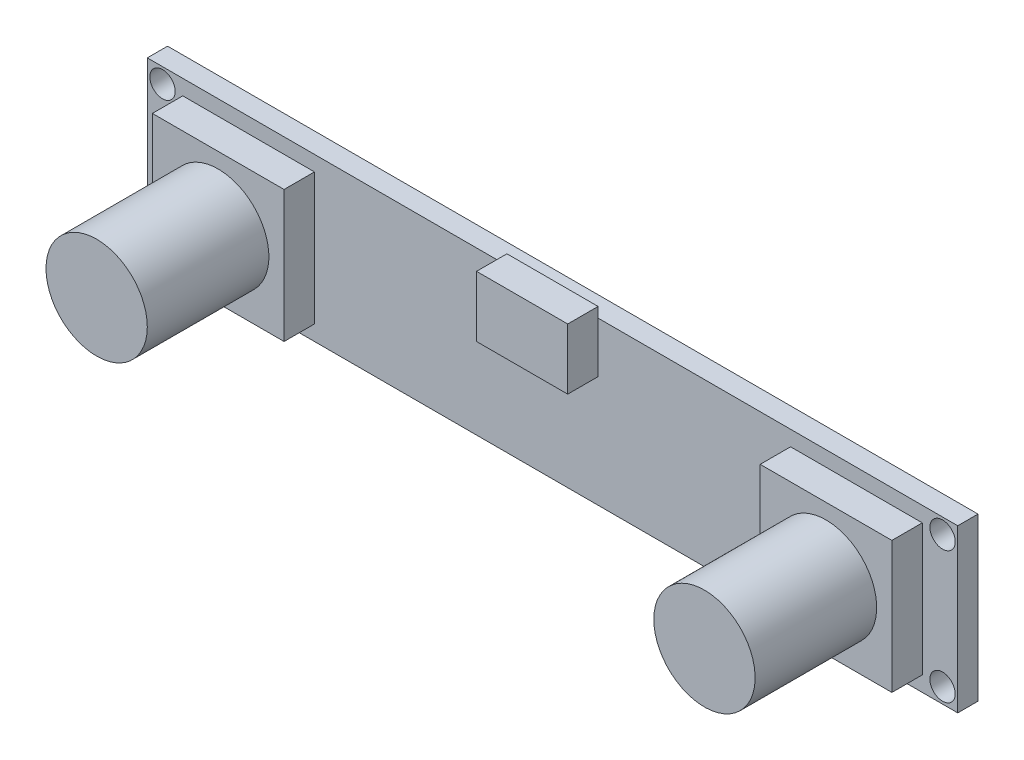
ISO-10303-21;
HEADER;
FILE_DESCRIPTION(('STEP AP214'),'2;1');
FILE_NAME('part.step','',(''),(''),'','','');
FILE_SCHEMA(('AUTOMOTIVE_DESIGN { 1 0 10303 214 1 1 1 1 }'));
ENDSEC;
DATA;
#1=APPLICATION_CONTEXT('core data for automotive mechanical design processes');
#2=APPLICATION_PROTOCOL_DEFINITION('international standard','automotive_design',2000,#1);
#3=PRODUCT_CONTEXT('',#1,'mechanical');
#4=PRODUCT('Part','Part','',(#3));
#5=PRODUCT_RELATED_PRODUCT_CATEGORY('part','',(#4));
#6=PRODUCT_DEFINITION_FORMATION('','',#4);
#7=PRODUCT_DEFINITION_CONTEXT('part definition',#1,'design');
#8=PRODUCT_DEFINITION('design','',#6,#7);
#9=PRODUCT_DEFINITION_SHAPE('','',#8);
#10=(LENGTH_UNIT() NAMED_UNIT(*) SI_UNIT(.MILLI.,.METRE.));
#11=(NAMED_UNIT(*) PLANE_ANGLE_UNIT() SI_UNIT($,.RADIAN.));
#12=(NAMED_UNIT(*) SI_UNIT($,.STERADIAN.) SOLID_ANGLE_UNIT());
#13=UNCERTAINTY_MEASURE_WITH_UNIT(LENGTH_MEASURE(1.E-05),#10,'distance_accuracy_value','');
#14=(GEOMETRIC_REPRESENTATION_CONTEXT(3) GLOBAL_UNCERTAINTY_ASSIGNED_CONTEXT((#13)) GLOBAL_UNIT_ASSIGNED_CONTEXT((#10,
#11,#12)) REPRESENTATION_CONTEXT('',''));
#15=CARTESIAN_POINT('',(0.,0.,0.));
#16=DIRECTION('',(0.,0.,1.));
#17=DIRECTION('',(1.,0.,0.));
#18=AXIS2_PLACEMENT_3D('',#15,#16,#17);
#19=CARTESIAN_POINT('',(0.,0.,2.));
#20=DIRECTION('',(0.,0.,-1.));
#21=DIRECTION('',(-1.,0.,0.));
#22=AXIS2_PLACEMENT_3D('',#19,#20,#21);
#23=PLANE('',#22);
#24=DIRECTION('',(0.,1.,0.));
#25=VECTOR('',#24,1.);
#26=CARTESIAN_POINT('',(-23.5,-6.5,2.));
#27=LINE('',#26,#25);
#28=CARTESIAN_POINT('',(-23.5,-6.5,2.));
#29=VERTEX_POINT('',#28);
#30=CARTESIAN_POINT('',(-23.5,6.5,2.));
#31=VERTEX_POINT('',#30);
#32=EDGE_CURVE('E226',#29,#31,#27,.T.);
#33=ORIENTED_EDGE('',*,*,#32,.F.);
#34=DIRECTION('',(1.,0.,0.));
#35=VECTOR('',#34,1.);
#36=CARTESIAN_POINT('',(-36.5,-6.5,2.));
#37=LINE('',#36,#35);
#38=CARTESIAN_POINT('',(-36.5,-6.5,2.));
#39=VERTEX_POINT('',#38);
#40=EDGE_CURVE('E231',#39,#29,#37,.T.);
#41=ORIENTED_EDGE('',*,*,#40,.F.);
#42=DIRECTION('',(0.,-1.,0.));
#43=VECTOR('',#42,1.);
#44=CARTESIAN_POINT('',(-36.5,-6.5,2.));
#45=LINE('',#44,#43);
#46=CARTESIAN_POINT('',(-36.5,6.5,2.));
#47=VERTEX_POINT('',#46);
#48=EDGE_CURVE('E243',#47,#39,#45,.T.);
#49=ORIENTED_EDGE('',*,*,#48,.F.);
#50=DIRECTION('',(-1.,0.,0.));
#51=VECTOR('',#50,1.);
#52=CARTESIAN_POINT('',(-36.5,6.5,2.));
#53=LINE('',#52,#51);
#54=EDGE_CURVE('E240',#31,#47,#53,.T.);
#55=ORIENTED_EDGE('',*,*,#54,.F.);
#56=EDGE_LOOP('',(#33,#41,#49,#55));
#57=FACE_BOUND('',#56,.T.);
#58=CARTESIAN_POINT('',(38.5,6.5,2.));
#59=DIRECTION('',(0.,0.,1.));
#60=DIRECTION('',(1.,0.,0.));
#61=AXIS2_PLACEMENT_3D('',#58,#59,#60);
#62=CIRCLE('',#61,1.25);
#63=CARTESIAN_POINT('',(39.75,6.5,2.));
#64=VERTEX_POINT('',#63);
#65=EDGE_CURVE('E264',#64,#64,#62,.T.);
#66=ORIENTED_EDGE('',*,*,#65,.F.);
#67=EDGE_LOOP('',(#66));
#68=FACE_BOUND('',#67,.T.);
#69=CARTESIAN_POINT('',(38.5,-6.5,2.));
#70=DIRECTION('',(0.,0.,1.));
#71=DIRECTION('',(1.,0.,0.));
#72=AXIS2_PLACEMENT_3D('',#69,#70,#71);
#73=CIRCLE('',#72,1.25);
#74=CARTESIAN_POINT('',(39.75,-6.5,2.));
#75=VERTEX_POINT('',#74);
#76=EDGE_CURVE('E270',#75,#75,#73,.T.);
#77=ORIENTED_EDGE('',*,*,#76,.F.);
#78=EDGE_LOOP('',(#77));
#79=FACE_BOUND('',#78,.T.);
#80=CARTESIAN_POINT('',(-38.5,-6.5,2.));
#81=DIRECTION('',(0.,0.,1.));
#82=DIRECTION('',(1.,0.,0.));
#83=AXIS2_PLACEMENT_3D('',#80,#81,#82);
#84=CIRCLE('',#83,1.25);
#85=CARTESIAN_POINT('',(-37.25,-6.5,2.));
#86=VERTEX_POINT('',#85);
#87=EDGE_CURVE('E259',#86,#86,#84,.T.);
#88=ORIENTED_EDGE('',*,*,#87,.F.);
#89=EDGE_LOOP('',(#88));
#90=FACE_BOUND('',#89,.T.);
#91=CARTESIAN_POINT('',(-38.5,6.5,2.));
#92=DIRECTION('',(0.,0.,1.));
#93=DIRECTION('',(1.,0.,0.));
#94=AXIS2_PLACEMENT_3D('',#91,#92,#93);
#95=CIRCLE('',#94,1.25);
#96=CARTESIAN_POINT('',(-37.25,6.5,2.));
#97=VERTEX_POINT('',#96);
#98=EDGE_CURVE('E263',#97,#97,#95,.T.);
#99=ORIENTED_EDGE('',*,*,#98,.F.);
#100=EDGE_LOOP('',(#99));
#101=FACE_BOUND('',#100,.T.);
#102=DIRECTION('',(-1.,0.,0.));
#103=VECTOR('',#102,1.);
#104=CARTESIAN_POINT('',(36.5,-6.5,2.));
#105=LINE('',#104,#103);
#106=CARTESIAN_POINT('',(36.5,-6.5,2.));
#107=VERTEX_POINT('',#106);
#108=CARTESIAN_POINT('',(23.5,-6.5,2.));
#109=VERTEX_POINT('',#108);
#110=EDGE_CURVE('E207',#107,#109,#105,.T.);
#111=ORIENTED_EDGE('',*,*,#110,.T.);
#112=DIRECTION('',(0.,1.,0.));
#113=VECTOR('',#112,1.);
#114=CARTESIAN_POINT('',(23.5,-6.5,2.));
#115=LINE('',#114,#113);
#116=CARTESIAN_POINT('',(23.5,6.5,2.));
#117=VERTEX_POINT('',#116);
#118=EDGE_CURVE('E189',#109,#117,#115,.T.);
#119=ORIENTED_EDGE('',*,*,#118,.T.);
#120=DIRECTION('',(1.,0.,0.));
#121=VECTOR('',#120,1.);
#122=CARTESIAN_POINT('',(36.5,6.5,2.));
#123=LINE('',#122,#121);
#124=CARTESIAN_POINT('',(36.5,6.5,2.));
#125=VERTEX_POINT('',#124);
#126=EDGE_CURVE('E195',#117,#125,#123,.T.);
#127=ORIENTED_EDGE('',*,*,#126,.T.);
#128=DIRECTION('',(0.,-1.,0.));
#129=VECTOR('',#128,1.);
#130=CARTESIAN_POINT('',(36.5,-6.5,2.));
#131=LINE('',#130,#129);
#132=EDGE_CURVE('E210',#125,#107,#131,.T.);
#133=ORIENTED_EDGE('',*,*,#132,.T.);
#134=EDGE_LOOP('',(#111,#119,#127,#133));
#135=FACE_BOUND('',#134,.T.);
#136=DIRECTION('',(0.,1.,0.));
#137=VECTOR('',#136,1.);
#138=CARTESIAN_POINT('',(4.5,9.00000000000001,2.));
#139=LINE('',#138,#137);
#140=CARTESIAN_POINT('',(4.5,3.,2.));
#141=VERTEX_POINT('',#140);
#142=CARTESIAN_POINT('',(4.5,8.,2.));
#143=VERTEX_POINT('',#142);
#144=EDGE_CURVE('E51',#141,#143,#139,.T.);
#145=ORIENTED_EDGE('',*,*,#144,.F.);
#146=DIRECTION('',(1.,0.,0.));
#147=VECTOR('',#146,1.);
#148=CARTESIAN_POINT('',(-4.5,3.,2.));
#149=LINE('',#148,#147);
#150=CARTESIAN_POINT('',(-4.5,3.,2.));
#151=VERTEX_POINT('',#150);
#152=EDGE_CURVE('E55',#151,#141,#149,.T.);
#153=ORIENTED_EDGE('',*,*,#152,.F.);
#154=DIRECTION('',(0.,-1.,0.));
#155=VECTOR('',#154,1.);
#156=CARTESIAN_POINT('',(-4.5,9.00000000000001,2.));
#157=LINE('',#156,#155);
#158=CARTESIAN_POINT('',(-4.5,8.,2.));
#159=VERTEX_POINT('',#158);
#160=EDGE_CURVE('E331',#159,#151,#157,.T.);
#161=ORIENTED_EDGE('',*,*,#160,.F.);
#162=DIRECTION('',(-1.,0.,0.));
#163=VECTOR('',#162,1.);
#164=CARTESIAN_POINT('',(-40.,8.,2.));
#165=LINE('',#164,#163);
#166=CARTESIAN_POINT('',(-40.,8.,2.));
#167=VERTEX_POINT('',#166);
#168=EDGE_CURVE('E287',#159,#167,#165,.T.);
#169=ORIENTED_EDGE('',*,*,#168,.T.);
#170=DIRECTION('',(0.,-1.,0.));
#171=VECTOR('',#170,1.);
#172=CARTESIAN_POINT('',(-40.,-8.,2.));
#173=LINE('',#172,#171);
#174=CARTESIAN_POINT('',(-40.,-8.,2.));
#175=VERTEX_POINT('',#174);
#176=EDGE_CURVE('E291',#167,#175,#173,.T.);
#177=ORIENTED_EDGE('',*,*,#176,.T.);
#178=DIRECTION('',(1.,0.,0.));
#179=VECTOR('',#178,1.);
#180=CARTESIAN_POINT('',(-40.,-8.,2.));
#181=LINE('',#180,#179);
#182=CARTESIAN_POINT('',(40.,-8.,2.));
#183=VERTEX_POINT('',#182);
#184=EDGE_CURVE('E294',#175,#183,#181,.T.);
#185=ORIENTED_EDGE('',*,*,#184,.T.);
#186=DIRECTION('',(0.,1.,0.));
#187=VECTOR('',#186,1.);
#188=CARTESIAN_POINT('',(40.,-8.,2.));
#189=LINE('',#188,#187);
#190=CARTESIAN_POINT('',(40.,8.,2.));
#191=VERTEX_POINT('',#190);
#192=EDGE_CURVE('E284',#183,#191,#189,.T.);
#193=ORIENTED_EDGE('',*,*,#192,.T.);
#194=EDGE_CURVE('E289',#191,#143,#165,.T.);
#195=ORIENTED_EDGE('',*,*,#194,.T.);
#196=EDGE_LOOP('',(#145,#153,#161,#169,#177,#185,#193,#195));
#197=FACE_BOUND('',#196,.T.);
#198=ADVANCED_FACE('F36',(#57,#68,#79,#90,#101,#135,#197),#23,.F.);
#199=CARTESIAN_POINT('',(40.,-8.,2.));
#200=DIRECTION('',(-1.,0.,0.));
#201=DIRECTION('',(0.,0.,1.));
#202=AXIS2_PLACEMENT_3D('',#199,#200,#201);
#203=PLANE('',#202);
#204=DIRECTION('',(0.,1.,0.));
#205=VECTOR('',#204,1.);
#206=CARTESIAN_POINT('',(40.,-8.,0.));
#207=LINE('',#206,#205);
#208=CARTESIAN_POINT('',(40.,-8.,0.));
#209=VERTEX_POINT('',#208);
#210=CARTESIAN_POINT('',(40.,8.,0.));
#211=VERTEX_POINT('',#210);
#212=EDGE_CURVE('E281',#209,#211,#207,.T.);
#213=ORIENTED_EDGE('',*,*,#212,.T.);
#214=DIRECTION('',(0.,0.,-1.));
#215=VECTOR('',#214,1.);
#216=CARTESIAN_POINT('',(40.,8.,2.));
#217=LINE('',#216,#215);
#218=EDGE_CURVE('E44',#191,#211,#217,.T.);
#219=ORIENTED_EDGE('',*,*,#218,.F.);
#220=ORIENTED_EDGE('',*,*,#192,.F.);
#221=DIRECTION('',(0.,0.,-1.));
#222=VECTOR('',#221,1.);
#223=CARTESIAN_POINT('',(40.,-8.,2.));
#224=LINE('',#223,#222);
#225=EDGE_CURVE('E296',#183,#209,#224,.T.);
#226=ORIENTED_EDGE('',*,*,#225,.T.);
#227=EDGE_LOOP('',(#213,#219,#220,#226));
#228=FACE_BOUND('',#227,.T.);
#229=ADVANCED_FACE('F38',(#228),#203,.F.);
#230=CARTESIAN_POINT('',(-40.,8.,2.));
#231=DIRECTION('',(0.,-1.,0.));
#232=DIRECTION('',(0.,0.,-1.));
#233=AXIS2_PLACEMENT_3D('',#230,#231,#232);
#234=PLANE('',#233);
#235=DIRECTION('',(-1.,0.,0.));
#236=VECTOR('',#235,1.);
#237=CARTESIAN_POINT('',(-40.,8.,0.));
#238=LINE('',#237,#236);
#239=CARTESIAN_POINT('',(-40.,8.,0.));
#240=VERTEX_POINT('',#239);
#241=EDGE_CURVE('E299',#211,#240,#238,.T.);
#242=ORIENTED_EDGE('',*,*,#241,.T.);
#243=DIRECTION('',(0.,0.,-1.));
#244=VECTOR('',#243,1.);
#245=CARTESIAN_POINT('',(-40.,8.,2.));
#246=LINE('',#245,#244);
#247=EDGE_CURVE('E309',#167,#240,#246,.T.);
#248=ORIENTED_EDGE('',*,*,#247,.F.);
#249=ORIENTED_EDGE('',*,*,#168,.F.);
#250=EDGE_CURVE('E292',#143,#159,#165,.T.);
#251=ORIENTED_EDGE('',*,*,#250,.F.);
#252=ORIENTED_EDGE('',*,*,#194,.F.);
#253=ORIENTED_EDGE('',*,*,#218,.T.);
#254=EDGE_LOOP('',(#242,#248,#249,#251,#252,#253));
#255=FACE_BOUND('',#254,.T.);
#256=ADVANCED_FACE('F314',(#255),#234,.F.);
#257=CARTESIAN_POINT('',(-40.,-8.,2.));
#258=DIRECTION('',(1.,0.,0.));
#259=DIRECTION('',(0.,0.,-1.));
#260=AXIS2_PLACEMENT_3D('',#257,#258,#259);
#261=PLANE('',#260);
#262=DIRECTION('',(0.,-1.,0.));
#263=VECTOR('',#262,1.);
#264=CARTESIAN_POINT('',(-40.,-8.,0.));
#265=LINE('',#264,#263);
#266=CARTESIAN_POINT('',(-40.,-8.,0.));
#267=VERTEX_POINT('',#266);
#268=EDGE_CURVE('E301',#240,#267,#265,.T.);
#269=ORIENTED_EDGE('',*,*,#268,.T.);
#270=DIRECTION('',(0.,0.,-1.));
#271=VECTOR('',#270,1.);
#272=CARTESIAN_POINT('',(-40.,-8.,2.));
#273=LINE('',#272,#271);
#274=EDGE_CURVE('E306',#175,#267,#273,.T.);
#275=ORIENTED_EDGE('',*,*,#274,.F.);
#276=ORIENTED_EDGE('',*,*,#176,.F.);
#277=ORIENTED_EDGE('',*,*,#247,.T.);
#278=EDGE_LOOP('',(#269,#275,#276,#277));
#279=FACE_BOUND('',#278,.T.);
#280=ADVANCED_FACE('F326',(#279),#261,.F.);
#281=CARTESIAN_POINT('',(-40.,-8.,2.));
#282=DIRECTION('',(0.,1.,0.));
#283=DIRECTION('',(0.,0.,1.));
#284=AXIS2_PLACEMENT_3D('',#281,#282,#283);
#285=PLANE('',#284);
#286=DIRECTION('',(1.,0.,0.));
#287=VECTOR('',#286,1.);
#288=CARTESIAN_POINT('',(-40.,-8.,0.));
#289=LINE('',#288,#287);
#290=EDGE_CURVE('E288',#267,#209,#289,.T.);
#291=ORIENTED_EDGE('',*,*,#290,.T.);
#292=ORIENTED_EDGE('',*,*,#225,.F.);
#293=ORIENTED_EDGE('',*,*,#184,.F.);
#294=ORIENTED_EDGE('',*,*,#274,.T.);
#295=EDGE_LOOP('',(#291,#292,#293,#294));
#296=FACE_BOUND('',#295,.T.);
#297=ADVANCED_FACE('F330',(#296),#285,.F.);
#298=CARTESIAN_POINT('',(0.,0.,0.));
#299=DIRECTION('',(0.,0.,-1.));
#300=DIRECTION('',(-1.,0.,0.));
#301=AXIS2_PLACEMENT_3D('',#298,#299,#300);
#302=PLANE('',#301);
#303=CARTESIAN_POINT('',(38.5,6.5,0.));
#304=DIRECTION('',(0.,0.,1.));
#305=DIRECTION('',(1.,0.,0.));
#306=AXIS2_PLACEMENT_3D('',#303,#304,#305);
#307=CIRCLE('',#306,1.25);
#308=CARTESIAN_POINT('',(39.75,6.5,0.));
#309=VERTEX_POINT('',#308);
#310=EDGE_CURVE('E260',#309,#309,#307,.T.);
#311=ORIENTED_EDGE('',*,*,#310,.T.);
#312=EDGE_LOOP('',(#311));
#313=FACE_BOUND('',#312,.T.);
#314=CARTESIAN_POINT('',(38.5,-6.5,0.));
#315=DIRECTION('',(0.,0.,1.));
#316=DIRECTION('',(1.,0.,0.));
#317=AXIS2_PLACEMENT_3D('',#314,#315,#316);
#318=CIRCLE('',#317,1.25);
#319=CARTESIAN_POINT('',(39.75,-6.5,0.));
#320=VERTEX_POINT('',#319);
#321=EDGE_CURVE('E267',#320,#320,#318,.T.);
#322=ORIENTED_EDGE('',*,*,#321,.T.);
#323=EDGE_LOOP('',(#322));
#324=FACE_BOUND('',#323,.T.);
#325=CARTESIAN_POINT('',(-38.5,-6.5,0.));
#326=DIRECTION('',(0.,0.,1.));
#327=DIRECTION('',(1.,0.,0.));
#328=AXIS2_PLACEMENT_3D('',#325,#326,#327);
#329=CIRCLE('',#328,1.25);
#330=CARTESIAN_POINT('',(-37.25,-6.5,0.));
#331=VERTEX_POINT('',#330);
#332=EDGE_CURVE('E273',#331,#331,#329,.T.);
#333=ORIENTED_EDGE('',*,*,#332,.T.);
#334=EDGE_LOOP('',(#333));
#335=FACE_BOUND('',#334,.T.);
#336=CARTESIAN_POINT('',(-38.5,6.5,0.));
#337=DIRECTION('',(0.,0.,1.));
#338=DIRECTION('',(1.,0.,0.));
#339=AXIS2_PLACEMENT_3D('',#336,#337,#338);
#340=CIRCLE('',#339,1.25);
#341=CARTESIAN_POINT('',(-37.25,6.5,0.));
#342=VERTEX_POINT('',#341);
#343=EDGE_CURVE('E278',#342,#342,#340,.T.);
#344=ORIENTED_EDGE('',*,*,#343,.T.);
#345=EDGE_LOOP('',(#344));
#346=FACE_BOUND('',#345,.T.);
#347=ORIENTED_EDGE('',*,*,#212,.F.);
#348=ORIENTED_EDGE('',*,*,#290,.F.);
#349=ORIENTED_EDGE('',*,*,#268,.F.);
#350=ORIENTED_EDGE('',*,*,#241,.F.);
#351=EDGE_LOOP('',(#347,#348,#349,#350));
#352=FACE_BOUND('',#351,.T.);
#353=ADVANCED_FACE('F322',(#313,#324,#335,#346,#352),#302,.T.);
#354=CARTESIAN_POINT('',(-38.5,6.5,0.));
#355=DIRECTION('',(0.,0.,1.));
#356=DIRECTION('',(1.,0.,0.));
#357=AXIS2_PLACEMENT_3D('',#354,#355,#356);
#358=CYLINDRICAL_SURFACE('',#357,1.25);
#359=ORIENTED_EDGE('',*,*,#343,.F.);
#360=EDGE_LOOP('',(#359));
#361=FACE_BOUND('',#360,.T.);
#362=ORIENTED_EDGE('',*,*,#98,.T.);
#363=EDGE_LOOP('',(#362));
#364=FACE_BOUND('',#363,.T.);
#365=ADVANCED_FACE('F371',(#361,#364),#358,.F.);
#366=CARTESIAN_POINT('',(-38.5,-6.5,0.));
#367=DIRECTION('',(0.,0.,1.));
#368=DIRECTION('',(1.,0.,0.));
#369=AXIS2_PLACEMENT_3D('',#366,#367,#368);
#370=CYLINDRICAL_SURFACE('',#369,1.25);
#371=ORIENTED_EDGE('',*,*,#332,.F.);
#372=EDGE_LOOP('',(#371));
#373=FACE_BOUND('',#372,.T.);
#374=ORIENTED_EDGE('',*,*,#87,.T.);
#375=EDGE_LOOP('',(#374));
#376=FACE_BOUND('',#375,.T.);
#377=ADVANCED_FACE('F403',(#373,#376),#370,.F.);
#378=CARTESIAN_POINT('',(38.5,-6.5,0.));
#379=DIRECTION('',(0.,0.,1.));
#380=DIRECTION('',(1.,0.,0.));
#381=AXIS2_PLACEMENT_3D('',#378,#379,#380);
#382=CYLINDRICAL_SURFACE('',#381,1.25);
#383=ORIENTED_EDGE('',*,*,#321,.F.);
#384=EDGE_LOOP('',(#383));
#385=FACE_BOUND('',#384,.T.);
#386=ORIENTED_EDGE('',*,*,#76,.T.);
#387=EDGE_LOOP('',(#386));
#388=FACE_BOUND('',#387,.T.);
#389=ADVANCED_FACE('F410',(#385,#388),#382,.F.);
#390=CARTESIAN_POINT('',(38.5,6.5,0.));
#391=DIRECTION('',(0.,0.,1.));
#392=DIRECTION('',(1.,0.,0.));
#393=AXIS2_PLACEMENT_3D('',#390,#391,#392);
#394=CYLINDRICAL_SURFACE('',#393,1.25);
#395=ORIENTED_EDGE('',*,*,#310,.F.);
#396=EDGE_LOOP('',(#395));
#397=FACE_BOUND('',#396,.T.);
#398=ORIENTED_EDGE('',*,*,#65,.T.);
#399=EDGE_LOOP('',(#398));
#400=FACE_BOUND('',#399,.T.);
#401=ADVANCED_FACE('F417',(#397,#400),#394,.F.);
#402=CARTESIAN_POINT('',(-23.5,-6.5,5.));
#403=DIRECTION('',(-1.,0.,0.));
#404=DIRECTION('',(0.,-1.,0.));
#405=AXIS2_PLACEMENT_3D('',#402,#403,#404);
#406=PLANE('',#405);
#407=ORIENTED_EDGE('',*,*,#32,.T.);
#408=DIRECTION('',(0.,0.,-1.));
#409=VECTOR('',#408,1.);
#410=CARTESIAN_POINT('',(-23.5,6.5,5.));
#411=LINE('',#410,#409);
#412=CARTESIAN_POINT('',(-23.5,6.5,5.));
#413=VERTEX_POINT('',#412);
#414=EDGE_CURVE('E256',#413,#31,#411,.T.);
#415=ORIENTED_EDGE('',*,*,#414,.F.);
#416=DIRECTION('',(0.,1.,0.));
#417=VECTOR('',#416,1.);
#418=CARTESIAN_POINT('',(-23.5,-6.5,5.));
#419=LINE('',#418,#417);
#420=CARTESIAN_POINT('',(-23.5,-6.5,5.));
#421=VERTEX_POINT('',#420);
#422=EDGE_CURVE('E227',#421,#413,#419,.T.);
#423=ORIENTED_EDGE('',*,*,#422,.F.);
#424=DIRECTION('',(0.,0.,-1.));
#425=VECTOR('',#424,1.);
#426=CARTESIAN_POINT('',(-23.5,-6.5,5.));
#427=LINE('',#426,#425);
#428=EDGE_CURVE('E237',#421,#29,#427,.T.);
#429=ORIENTED_EDGE('',*,*,#428,.T.);
#430=EDGE_LOOP('',(#407,#415,#423,#429));
#431=FACE_BOUND('',#430,.T.);
#432=ADVANCED_FACE('F425',(#431),#406,.F.);
#433=CARTESIAN_POINT('',(-36.5,6.5,5.));
#434=DIRECTION('',(0.,-1.,0.));
#435=DIRECTION('',(0.,0.,-1.));
#436=AXIS2_PLACEMENT_3D('',#433,#434,#435);
#437=PLANE('',#436);
#438=ORIENTED_EDGE('',*,*,#54,.T.);
#439=DIRECTION('',(0.,0.,-1.));
#440=VECTOR('',#439,1.);
#441=CARTESIAN_POINT('',(-36.5,6.5,5.));
#442=LINE('',#441,#440);
#443=CARTESIAN_POINT('',(-36.5,6.5,5.));
#444=VERTEX_POINT('',#443);
#445=EDGE_CURVE('E253',#444,#47,#442,.T.);
#446=ORIENTED_EDGE('',*,*,#445,.F.);
#447=DIRECTION('',(-1.,0.,0.));
#448=VECTOR('',#447,1.);
#449=CARTESIAN_POINT('',(-36.5,6.5,5.));
#450=LINE('',#449,#448);
#451=EDGE_CURVE('E230',#413,#444,#450,.T.);
#452=ORIENTED_EDGE('',*,*,#451,.F.);
#453=ORIENTED_EDGE('',*,*,#414,.T.);
#454=EDGE_LOOP('',(#438,#446,#452,#453));
#455=FACE_BOUND('',#454,.T.);
#456=ADVANCED_FACE('F433',(#455),#437,.F.);
#457=CARTESIAN_POINT('',(-36.5,-6.5,5.));
#458=DIRECTION('',(1.,0.,0.));
#459=DIRECTION('',(0.,0.,-1.));
#460=AXIS2_PLACEMENT_3D('',#457,#458,#459);
#461=PLANE('',#460);
#462=ORIENTED_EDGE('',*,*,#48,.T.);
#463=DIRECTION('',(0.,0.,-1.));
#464=VECTOR('',#463,1.);
#465=CARTESIAN_POINT('',(-36.5,-6.5,5.));
#466=LINE('',#465,#464);
#467=CARTESIAN_POINT('',(-36.5,-6.5,5.));
#468=VERTEX_POINT('',#467);
#469=EDGE_CURVE('E250',#468,#39,#466,.T.);
#470=ORIENTED_EDGE('',*,*,#469,.F.);
#471=DIRECTION('',(0.,-1.,0.));
#472=VECTOR('',#471,1.);
#473=CARTESIAN_POINT('',(-36.5,-6.5,5.));
#474=LINE('',#473,#472);
#475=EDGE_CURVE('E233',#444,#468,#474,.T.);
#476=ORIENTED_EDGE('',*,*,#475,.F.);
#477=ORIENTED_EDGE('',*,*,#445,.T.);
#478=EDGE_LOOP('',(#462,#470,#476,#477));
#479=FACE_BOUND('',#478,.T.);
#480=ADVANCED_FACE('F441',(#479),#461,.F.);
#481=CARTESIAN_POINT('',(-36.5,-6.5,5.));
#482=DIRECTION('',(0.,1.,0.));
#483=DIRECTION('',(0.,0.,1.));
#484=AXIS2_PLACEMENT_3D('',#481,#482,#483);
#485=PLANE('',#484);
#486=ORIENTED_EDGE('',*,*,#40,.T.);
#487=ORIENTED_EDGE('',*,*,#428,.F.);
#488=DIRECTION('',(1.,0.,0.));
#489=VECTOR('',#488,1.);
#490=CARTESIAN_POINT('',(-36.5,-6.5,5.));
#491=LINE('',#490,#489);
#492=EDGE_CURVE('E235',#468,#421,#491,.T.);
#493=ORIENTED_EDGE('',*,*,#492,.F.);
#494=ORIENTED_EDGE('',*,*,#469,.T.);
#495=EDGE_LOOP('',(#486,#487,#493,#494));
#496=FACE_BOUND('',#495,.T.);
#497=ADVANCED_FACE('F449',(#496),#485,.F.);
#498=CARTESIAN_POINT('',(0.,0.,5.));
#499=DIRECTION('',(0.,0.,-1.));
#500=DIRECTION('',(-1.,0.,0.));
#501=AXIS2_PLACEMENT_3D('',#498,#499,#500);
#502=PLANE('',#501);
#503=CARTESIAN_POINT('',(-30.,0.,5.));
#504=DIRECTION('',(0.,0.,-1.));
#505=DIRECTION('',(-1.,0.,0.));
#506=AXIS2_PLACEMENT_3D('',#503,#504,#505);
#507=CIRCLE('',#506,5.);
#508=CARTESIAN_POINT('',(-35.,0.,5.));
#509=VERTEX_POINT('',#508);
#510=EDGE_CURVE('E11',#509,#509,#507,.F.);
#511=ORIENTED_EDGE('',*,*,#510,.F.);
#512=EDGE_LOOP('',(#511));
#513=FACE_BOUND('',#512,.T.);
#514=ORIENTED_EDGE('',*,*,#422,.T.);
#515=ORIENTED_EDGE('',*,*,#451,.T.);
#516=ORIENTED_EDGE('',*,*,#475,.T.);
#517=ORIENTED_EDGE('',*,*,#492,.T.);
#518=EDGE_LOOP('',(#514,#515,#516,#517));
#519=FACE_BOUND('',#518,.T.);
#520=ADVANCED_FACE('F457',(#513,#519),#502,.F.);
#521=CARTESIAN_POINT('',(-30.,0.,17.));
#522=DIRECTION('',(0.,0.,-1.));
#523=DIRECTION('',(-1.,0.,0.));
#524=AXIS2_PLACEMENT_3D('',#521,#522,#523);
#525=CYLINDRICAL_SURFACE('',#524,5.);
#526=CARTESIAN_POINT('',(-30.,0.,17.));
#527=DIRECTION('',(0.,0.,1.));
#528=DIRECTION('',(1.,0.,0.));
#529=AXIS2_PLACEMENT_3D('',#526,#527,#528);
#530=CIRCLE('',#529,5.);
#531=CARTESIAN_POINT('',(-25.,0.,17.));
#532=VERTEX_POINT('',#531);
#533=EDGE_CURVE('E223',#532,#532,#530,.T.);
#534=ORIENTED_EDGE('',*,*,#533,.F.);
#535=EDGE_LOOP('',(#534));
#536=FACE_BOUND('',#535,.T.);
#537=ORIENTED_EDGE('',*,*,#510,.T.);
#538=EDGE_LOOP('',(#537));
#539=FACE_BOUND('',#538,.T.);
#540=ADVANCED_FACE('F465',(#536,#539),#525,.T.);
#541=CARTESIAN_POINT('',(-30.,0.,17.));
#542=DIRECTION('',(0.,0.,1.));
#543=DIRECTION('',(1.,0.,0.));
#544=AXIS2_PLACEMENT_3D('',#541,#542,#543);
#545=PLANE('',#544);
#546=ORIENTED_EDGE('',*,*,#533,.T.);
#547=EDGE_LOOP('',(#546));
#548=FACE_BOUND('',#547,.T.);
#549=ADVANCED_FACE('F473',(#548),#545,.T.);
#550=CARTESIAN_POINT('',(23.5,-6.5,5.));
#551=DIRECTION('',(-1.,0.,0.));
#552=DIRECTION('',(0.,-1.,0.));
#553=AXIS2_PLACEMENT_3D('',#550,#551,#552);
#554=PLANE('',#553);
#555=ORIENTED_EDGE('',*,*,#118,.F.);
#556=DIRECTION('',(0.,0.,-1.));
#557=VECTOR('',#556,1.);
#558=CARTESIAN_POINT('',(23.5,-6.5,5.));
#559=LINE('',#558,#557);
#560=CARTESIAN_POINT('',(23.5,-6.5,5.));
#561=VERTEX_POINT('',#560);
#562=EDGE_CURVE('E221',#561,#109,#559,.T.);
#563=ORIENTED_EDGE('',*,*,#562,.F.);
#564=DIRECTION('',(0.,1.,0.));
#565=VECTOR('',#564,1.);
#566=CARTESIAN_POINT('',(23.5,-6.5,5.));
#567=LINE('',#566,#565);
#568=CARTESIAN_POINT('',(23.5,6.5,5.));
#569=VERTEX_POINT('',#568);
#570=EDGE_CURVE('E191',#561,#569,#567,.T.);
#571=ORIENTED_EDGE('',*,*,#570,.T.);
#572=DIRECTION('',(0.,0.,-1.));
#573=VECTOR('',#572,1.);
#574=CARTESIAN_POINT('',(23.5,6.5,5.));
#575=LINE('',#574,#573);
#576=EDGE_CURVE('E204',#569,#117,#575,.T.);
#577=ORIENTED_EDGE('',*,*,#576,.T.);
#578=EDGE_LOOP('',(#555,#563,#571,#577));
#579=FACE_BOUND('',#578,.T.);
#580=ADVANCED_FACE('F482',(#579),#554,.T.);
#581=CARTESIAN_POINT('',(36.5,-6.5,5.));
#582=DIRECTION('',(0.,-1.,0.));
#583=DIRECTION('',(0.,0.,-1.));
#584=AXIS2_PLACEMENT_3D('',#581,#582,#583);
#585=PLANE('',#584);
#586=ORIENTED_EDGE('',*,*,#110,.F.);
#587=DIRECTION('',(0.,0.,-1.));
#588=VECTOR('',#587,1.);
#589=CARTESIAN_POINT('',(36.5,-6.5,5.));
#590=LINE('',#589,#588);
#591=CARTESIAN_POINT('',(36.5,-6.5,5.));
#592=VERTEX_POINT('',#591);
#593=EDGE_CURVE('E219',#592,#107,#590,.T.);
#594=ORIENTED_EDGE('',*,*,#593,.F.);
#595=DIRECTION('',(-1.,0.,0.));
#596=VECTOR('',#595,1.);
#597=CARTESIAN_POINT('',(36.5,-6.5,5.));
#598=LINE('',#597,#596);
#599=EDGE_CURVE('E194',#592,#561,#598,.T.);
#600=ORIENTED_EDGE('',*,*,#599,.T.);
#601=ORIENTED_EDGE('',*,*,#562,.T.);
#602=EDGE_LOOP('',(#586,#594,#600,#601));
#603=FACE_BOUND('',#602,.T.);
#604=ADVANCED_FACE('F490',(#603),#585,.T.);
#605=CARTESIAN_POINT('',(36.5,-6.5,5.));
#606=DIRECTION('',(1.,0.,0.));
#607=DIRECTION('',(0.,0.,-1.));
#608=AXIS2_PLACEMENT_3D('',#605,#606,#607);
#609=PLANE('',#608);
#610=ORIENTED_EDGE('',*,*,#132,.F.);
#611=DIRECTION('',(0.,0.,-1.));
#612=VECTOR('',#611,1.);
#613=CARTESIAN_POINT('',(36.5,6.5,5.));
#614=LINE('',#613,#612);
#615=CARTESIAN_POINT('',(36.5,6.5,5.));
#616=VERTEX_POINT('',#615);
#617=EDGE_CURVE('E216',#616,#125,#614,.T.);
#618=ORIENTED_EDGE('',*,*,#617,.F.);
#619=DIRECTION('',(0.,-1.,0.));
#620=VECTOR('',#619,1.);
#621=CARTESIAN_POINT('',(36.5,-6.5,5.));
#622=LINE('',#621,#620);
#623=EDGE_CURVE('E198',#616,#592,#622,.T.);
#624=ORIENTED_EDGE('',*,*,#623,.T.);
#625=ORIENTED_EDGE('',*,*,#593,.T.);
#626=EDGE_LOOP('',(#610,#618,#624,#625));
#627=FACE_BOUND('',#626,.T.);
#628=ADVANCED_FACE('F498',(#627),#609,.T.);
#629=CARTESIAN_POINT('',(36.5,6.5,5.));
#630=DIRECTION('',(0.,1.,0.));
#631=DIRECTION('',(0.,0.,1.));
#632=AXIS2_PLACEMENT_3D('',#629,#630,#631);
#633=PLANE('',#632);
#634=ORIENTED_EDGE('',*,*,#126,.F.);
#635=ORIENTED_EDGE('',*,*,#576,.F.);
#636=DIRECTION('',(1.,0.,0.));
#637=VECTOR('',#636,1.);
#638=CARTESIAN_POINT('',(36.5,6.5,5.));
#639=LINE('',#638,#637);
#640=EDGE_CURVE('E201',#569,#616,#639,.T.);
#641=ORIENTED_EDGE('',*,*,#640,.T.);
#642=ORIENTED_EDGE('',*,*,#617,.T.);
#643=EDGE_LOOP('',(#634,#635,#641,#642));
#644=FACE_BOUND('',#643,.T.);
#645=ADVANCED_FACE('F506',(#644),#633,.T.);
#646=CARTESIAN_POINT('',(0.,0.,5.));
#647=DIRECTION('',(0.,0.,-1.));
#648=DIRECTION('',(1.,0.,0.));
#649=AXIS2_PLACEMENT_3D('',#646,#647,#648);
#650=PLANE('',#649);
#651=CARTESIAN_POINT('',(30.,0.,5.));
#652=DIRECTION('',(0.,0.,-1.));
#653=DIRECTION('',(-1.,0.,0.));
#654=AXIS2_PLACEMENT_3D('',#651,#652,#653);
#655=CIRCLE('',#654,5.);
#656=CARTESIAN_POINT('',(25.,0.,5.));
#657=VERTEX_POINT('',#656);
#658=EDGE_CURVE('E179',#657,#657,#655,.T.);
#659=ORIENTED_EDGE('',*,*,#658,.T.);
#660=EDGE_LOOP('',(#659));
#661=FACE_BOUND('',#660,.T.);
#662=ORIENTED_EDGE('',*,*,#570,.F.);
#663=ORIENTED_EDGE('',*,*,#599,.F.);
#664=ORIENTED_EDGE('',*,*,#623,.F.);
#665=ORIENTED_EDGE('',*,*,#640,.F.);
#666=EDGE_LOOP('',(#662,#663,#664,#665));
#667=FACE_BOUND('',#666,.T.);
#668=ADVANCED_FACE('F514',(#661,#667),#650,.F.);
#669=CARTESIAN_POINT('',(30.,0.,17.));
#670=DIRECTION('',(0.,0.,-1.));
#671=DIRECTION('',(-1.,0.,0.));
#672=AXIS2_PLACEMENT_3D('',#669,#670,#671);
#673=CYLINDRICAL_SURFACE('',#672,5.);
#674=CARTESIAN_POINT('',(30.,0.,17.));
#675=DIRECTION('',(0.,0.,-1.));
#676=DIRECTION('',(-1.,0.,0.));
#677=AXIS2_PLACEMENT_3D('',#674,#675,#676);
#678=CIRCLE('',#677,5.);
#679=CARTESIAN_POINT('',(25.,0.,17.));
#680=VERTEX_POINT('',#679);
#681=EDGE_CURVE('E182',#680,#680,#678,.T.);
#682=ORIENTED_EDGE('',*,*,#681,.T.);
#683=EDGE_LOOP('',(#682));
#684=FACE_BOUND('',#683,.T.);
#685=ORIENTED_EDGE('',*,*,#658,.F.);
#686=EDGE_LOOP('',(#685));
#687=FACE_BOUND('',#686,.T.);
#688=ADVANCED_FACE('F522',(#684,#687),#673,.T.);
#689=CARTESIAN_POINT('',(30.,0.,17.));
#690=DIRECTION('',(0.,0.,1.));
#691=DIRECTION('',(-1.,0.,0.));
#692=AXIS2_PLACEMENT_3D('',#689,#690,#691);
#693=PLANE('',#692);
#694=ORIENTED_EDGE('',*,*,#681,.F.);
#695=EDGE_LOOP('',(#694));
#696=FACE_BOUND('',#695,.T.);
#697=ADVANCED_FACE('F530',(#696),#693,.T.);
#698=CARTESIAN_POINT('',(0.,0.,2.));
#699=DIRECTION('',(0.,0.,1.));
#700=DIRECTION('',(1.,0.,0.));
#701=AXIS2_PLACEMENT_3D('',#698,#699,#700);
#702=PLANE('',#701);
#703=CARTESIAN_POINT('',(4.5,9.00000000000001,2.));
#704=VERTEX_POINT('',#703);
#705=EDGE_CURVE('E177',#143,#704,#139,.T.);
#706=ORIENTED_EDGE('',*,*,#705,.F.);
#707=ORIENTED_EDGE('',*,*,#250,.T.);
#708=CARTESIAN_POINT('',(-4.5,9.00000000000001,2.));
#709=VERTEX_POINT('',#708);
#710=EDGE_CURVE('E337',#709,#159,#157,.T.);
#711=ORIENTED_EDGE('',*,*,#710,.F.);
#712=DIRECTION('',(-1.,0.,0.));
#713=VECTOR('',#712,1.);
#714=CARTESIAN_POINT('',(-4.5,9.00000000000001,2.));
#715=LINE('',#714,#713);
#716=EDGE_CURVE('E344',#704,#709,#715,.T.);
#717=ORIENTED_EDGE('',*,*,#716,.F.);
#718=EDGE_LOOP('',(#706,#707,#711,#717));
#719=FACE_BOUND('',#718,.T.);
#720=ADVANCED_FACE('F336',(#719),#702,.F.);
#721=CARTESIAN_POINT('',(4.5,9.00000000000001,5.));
#722=DIRECTION('',(-1.,0.,0.));
#723=DIRECTION('',(0.,-1.,0.));
#724=AXIS2_PLACEMENT_3D('',#721,#722,#723);
#725=PLANE('',#724);
#726=ORIENTED_EDGE('',*,*,#144,.T.);
#727=ORIENTED_EDGE('',*,*,#705,.T.);
#728=DIRECTION('',(0.,0.,-1.));
#729=VECTOR('',#728,1.);
#730=CARTESIAN_POINT('',(4.5,9.00000000000001,5.));
#731=LINE('',#730,#729);
#732=CARTESIAN_POINT('',(4.5,9.00000000000001,5.));
#733=VERTEX_POINT('',#732);
#734=EDGE_CURVE('E159',#733,#704,#731,.T.);
#735=ORIENTED_EDGE('',*,*,#734,.F.);
#736=DIRECTION('',(0.,1.,0.));
#737=VECTOR('',#736,1.);
#738=CARTESIAN_POINT('',(4.5,9.00000000000001,5.));
#739=LINE('',#738,#737);
#740=CARTESIAN_POINT('',(4.5,3.,5.));
#741=VERTEX_POINT('',#740);
#742=EDGE_CURVE('E165',#741,#733,#739,.T.);
#743=ORIENTED_EDGE('',*,*,#742,.F.);
#744=DIRECTION('',(0.,0.,-1.));
#745=VECTOR('',#744,1.);
#746=CARTESIAN_POINT('',(4.5,3.,5.));
#747=LINE('',#746,#745);
#748=EDGE_CURVE('E348',#741,#141,#747,.T.);
#749=ORIENTED_EDGE('',*,*,#748,.T.);
#750=EDGE_LOOP('',(#726,#727,#735,#743,#749));
#751=FACE_BOUND('',#750,.T.);
#752=ADVANCED_FACE('F175',(#751),#725,.F.);
#753=CARTESIAN_POINT('',(-4.5,9.00000000000001,5.));
#754=DIRECTION('',(0.,-1.,0.));
#755=DIRECTION('',(0.,0.,-1.));
#756=AXIS2_PLACEMENT_3D('',#753,#754,#755);
#757=PLANE('',#756);
#758=ORIENTED_EDGE('',*,*,#716,.T.);
#759=DIRECTION('',(0.,0.,-1.));
#760=VECTOR('',#759,1.);
#761=CARTESIAN_POINT('',(-4.5,9.00000000000001,5.));
#762=LINE('',#761,#760);
#763=CARTESIAN_POINT('',(-4.5,9.00000000000001,5.));
#764=VERTEX_POINT('',#763);
#765=EDGE_CURVE('E161',#764,#709,#762,.T.);
#766=ORIENTED_EDGE('',*,*,#765,.F.);
#767=DIRECTION('',(-1.,0.,0.));
#768=VECTOR('',#767,1.);
#769=CARTESIAN_POINT('',(-4.5,9.00000000000001,5.));
#770=LINE('',#769,#768);
#771=EDGE_CURVE('E155',#733,#764,#770,.T.);
#772=ORIENTED_EDGE('',*,*,#771,.F.);
#773=ORIENTED_EDGE('',*,*,#734,.T.);
#774=EDGE_LOOP('',(#758,#766,#772,#773));
#775=FACE_BOUND('',#774,.T.);
#776=ADVANCED_FACE('F157',(#775),#757,.F.);
#777=CARTESIAN_POINT('',(-4.5,9.00000000000001,5.));
#778=DIRECTION('',(1.,0.,0.));
#779=DIRECTION('',(0.,1.,0.));
#780=AXIS2_PLACEMENT_3D('',#777,#778,#779);
#781=PLANE('',#780);
#782=ORIENTED_EDGE('',*,*,#710,.T.);
#783=ORIENTED_EDGE('',*,*,#160,.T.);
#784=DIRECTION('',(0.,0.,-1.));
#785=VECTOR('',#784,1.);
#786=CARTESIAN_POINT('',(-4.5,3.,5.));
#787=LINE('',#786,#785);
#788=CARTESIAN_POINT('',(-4.5,3.,5.));
#789=VERTEX_POINT('',#788);
#790=EDGE_CURVE('E184',#789,#151,#787,.T.);
#791=ORIENTED_EDGE('',*,*,#790,.F.);
#792=DIRECTION('',(0.,-1.,0.));
#793=VECTOR('',#792,1.);
#794=CARTESIAN_POINT('',(-4.5,9.00000000000001,5.));
#795=LINE('',#794,#793);
#796=EDGE_CURVE('E164',#764,#789,#795,.T.);
#797=ORIENTED_EDGE('',*,*,#796,.F.);
#798=ORIENTED_EDGE('',*,*,#765,.T.);
#799=EDGE_LOOP('',(#782,#783,#791,#797,#798));
#800=FACE_BOUND('',#799,.T.);
#801=ADVANCED_FACE('F339',(#800),#781,.F.);
#802=CARTESIAN_POINT('',(-4.5,3.,5.));
#803=DIRECTION('',(0.,1.,0.));
#804=DIRECTION('',(0.,0.,1.));
#805=AXIS2_PLACEMENT_3D('',#802,#803,#804);
#806=PLANE('',#805);
#807=ORIENTED_EDGE('',*,*,#152,.T.);
#808=ORIENTED_EDGE('',*,*,#748,.F.);
#809=DIRECTION('',(1.,0.,0.));
#810=VECTOR('',#809,1.);
#811=CARTESIAN_POINT('',(-4.5,3.,5.));
#812=LINE('',#811,#810);
#813=EDGE_CURVE('E170',#789,#741,#812,.T.);
#814=ORIENTED_EDGE('',*,*,#813,.F.);
#815=ORIENTED_EDGE('',*,*,#790,.T.);
#816=EDGE_LOOP('',(#807,#808,#814,#815));
#817=FACE_BOUND('',#816,.T.);
#818=ADVANCED_FACE('F350',(#817),#806,.F.);
#819=CARTESIAN_POINT('',(0.,0.,5.));
#820=DIRECTION('',(0.,0.,1.));
#821=DIRECTION('',(1.,0.,0.));
#822=AXIS2_PLACEMENT_3D('',#819,#820,#821);
#823=PLANE('',#822);
#824=ORIENTED_EDGE('',*,*,#742,.T.);
#825=ORIENTED_EDGE('',*,*,#771,.T.);
#826=ORIENTED_EDGE('',*,*,#796,.T.);
#827=ORIENTED_EDGE('',*,*,#813,.T.);
#828=EDGE_LOOP('',(#824,#825,#826,#827));
#829=FACE_BOUND('',#828,.T.);
#830=ADVANCED_FACE('F168',(#829),#823,.T.);
#831=CLOSED_SHELL('',(#198,#229,#256,#280,#297,#353,#365,#377,#389,#401,#432,#456,#480,#497,
#520,#540,#549,#580,#604,#628,#645,#668,#688,#697,#720,#752,#776,#801,#818,#830));
#832=MANIFOLD_SOLID_BREP('B2',#831);
#833=ADVANCED_BREP_SHAPE_REPRESENTATION('',(#18,#832),#14);
#834=SHAPE_DEFINITION_REPRESENTATION(#9,#833);
ENDSEC;
END-ISO-10303-21;
